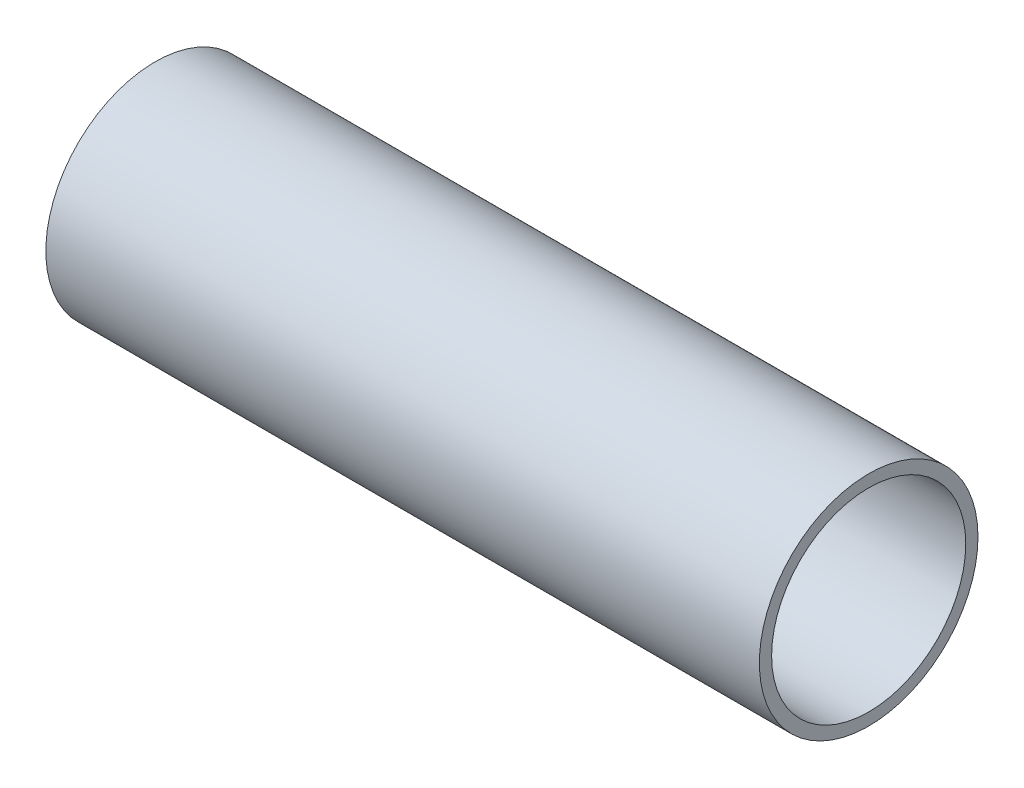
ISO-10303-21;
HEADER;
FILE_DESCRIPTION(('STEP AP214'),'2;1');
FILE_NAME('part.step','',(''),(''),'','','');
FILE_SCHEMA(('AUTOMOTIVE_DESIGN { 1 0 10303 214 1 1 1 1 }'));
ENDSEC;
DATA;
#1=APPLICATION_CONTEXT('core data for automotive mechanical design processes');
#2=APPLICATION_PROTOCOL_DEFINITION('international standard','automotive_design',2000,#1);
#3=PRODUCT_CONTEXT('',#1,'mechanical');
#4=PRODUCT('Part','Part','',(#3));
#5=PRODUCT_RELATED_PRODUCT_CATEGORY('part','',(#4));
#6=PRODUCT_DEFINITION_FORMATION('','',#4);
#7=PRODUCT_DEFINITION_CONTEXT('part definition',#1,'design');
#8=PRODUCT_DEFINITION('design','',#6,#7);
#9=PRODUCT_DEFINITION_SHAPE('','',#8);
#10=(LENGTH_UNIT() NAMED_UNIT(*) SI_UNIT(.MILLI.,.METRE.));
#11=(NAMED_UNIT(*) PLANE_ANGLE_UNIT() SI_UNIT($,.RADIAN.));
#12=(NAMED_UNIT(*) SI_UNIT($,.STERADIAN.) SOLID_ANGLE_UNIT());
#13=UNCERTAINTY_MEASURE_WITH_UNIT(LENGTH_MEASURE(1.E-05),#10,'distance_accuracy_value','');
#14=(GEOMETRIC_REPRESENTATION_CONTEXT(3) GLOBAL_UNCERTAINTY_ASSIGNED_CONTEXT((#13)) GLOBAL_UNIT_ASSIGNED_CONTEXT((#10,
#11,#12)) REPRESENTATION_CONTEXT('',''));
#15=CARTESIAN_POINT('',(0.,0.,0.));
#16=DIRECTION('',(0.,0.,1.));
#17=DIRECTION('',(1.,0.,0.));
#18=AXIS2_PLACEMENT_3D('',#15,#16,#17);
#19=CARTESIAN_POINT('',(-284.815253849037,0.,0.));
#20=DIRECTION('',(-1.,0.,0.));
#21=DIRECTION('',(0.,0.,1.));
#22=AXIS2_PLACEMENT_3D('',#19,#20,#21);
#23=PLANE('',#22);
#24=CARTESIAN_POINT('',(-284.815253849037,0.,0.));
#25=DIRECTION('',(-1.,0.,0.));
#26=DIRECTION('',(0.,0.,1.));
#27=AXIS2_PLACEMENT_3D('',#24,#25,#26);
#28=CIRCLE('',#27,6.35);
#29=CARTESIAN_POINT('',(-284.815253849037,0.,-6.35));
#30=VERTEX_POINT('',#29);
#31=EDGE_CURVE('E41',#30,#30,#28,.T.);
#32=ORIENTED_EDGE('',*,*,#31,.F.);
#33=EDGE_LOOP('',(#32));
#34=FACE_BOUND('',#33,.T.);
#35=CARTESIAN_POINT('',(-284.815253849037,0.,0.));
#36=DIRECTION('',(-1.,0.,0.));
#37=DIRECTION('',(0.,0.,1.));
#38=AXIS2_PLACEMENT_3D('',#35,#36,#37);
#39=CIRCLE('',#38,5.6388);
#40=CARTESIAN_POINT('',(-284.815253849037,0.,-5.6388));
#41=VERTEX_POINT('',#40);
#42=EDGE_CURVE('E51',#41,#41,#39,.T.);
#43=ORIENTED_EDGE('',*,*,#42,.T.);
#44=EDGE_LOOP('',(#43));
#45=FACE_BOUND('',#44,.T.);
#46=ADVANCED_FACE('F37',(#34,#45),#23,.F.);
#47=CARTESIAN_POINT('',(-344.223093310337,0.,0.));
#48=DIRECTION('',(1.,0.,0.));
#49=DIRECTION('',(0.,0.,-1.));
#50=AXIS2_PLACEMENT_3D('',#47,#48,#49);
#51=CYLINDRICAL_SURFACE('',#50,6.35);
#52=CARTESIAN_POINT('',(-326.2625810682,-2.3959347107273E-12,-1.58914958150256E-12));
#53=DIRECTION('',(1.,0.,0.));
#54=DIRECTION('',(0.,-0.387578230128538,0.921836816107075));
#55=AXIS2_PLACEMENT_3D('',#52,#53,#54);
#56=CIRCLE('',#55,6.35);
#57=CARTESIAN_POINT('',(-326.262581068199,0.,-6.35));
#58=VERTEX_POINT('',#57);
#59=EDGE_CURVE('E10',#58,#58,#56,.T.);
#60=CARTESIAN_POINT('',(-326.262581068199,0.,-6.35));
#61=CARTESIAN_POINT('',(-325.830838076333,0.,-6.35));
#62=CARTESIAN_POINT('',(-325.399095084467,0.,-6.35));
#63=CARTESIAN_POINT('',(-324.535609100734,0.,-6.35));
#64=CARTESIAN_POINT('',(-324.103866108868,0.,-6.35));
#65=CARTESIAN_POINT('',(-323.240380125135,0.,-6.35));
#66=CARTESIAN_POINT('',(-322.808637133269,0.,-6.35));
#67=CARTESIAN_POINT('',(-321.945151149536,0.,-6.35));
#68=CARTESIAN_POINT('',(-321.51340815767,0.,-6.35));
#69=CARTESIAN_POINT('',(-320.649922173938,0.,-6.35));
#70=CARTESIAN_POINT('',(-320.218179182071,0.,-6.35));
#71=CARTESIAN_POINT('',(-319.354693198339,0.,-6.35));
#72=CARTESIAN_POINT('',(-318.922950206473,0.,-6.35));
#73=CARTESIAN_POINT('',(-318.05946422274,0.,-6.35));
#74=CARTESIAN_POINT('',(-317.627721230874,0.,-6.35));
#75=CARTESIAN_POINT('',(-316.764235247141,0.,-6.35));
#76=CARTESIAN_POINT('',(-316.332492255275,0.,-6.35));
#77=CARTESIAN_POINT('',(-315.469006271542,0.,-6.35));
#78=CARTESIAN_POINT('',(-315.037263279676,0.,-6.35));
#79=CARTESIAN_POINT('',(-314.173777295944,0.,-6.35));
#80=CARTESIAN_POINT('',(-313.742034304077,0.,-6.35));
#81=CARTESIAN_POINT('',(-312.878548320345,0.,-6.35));
#82=CARTESIAN_POINT('',(-312.446805328478,0.,-6.35));
#83=CARTESIAN_POINT('',(-311.583319344746,0.,-6.35));
#84=CARTESIAN_POINT('',(-311.15157635288,0.,-6.35));
#85=CARTESIAN_POINT('',(-310.288090369147,0.,-6.35));
#86=CARTESIAN_POINT('',(-309.856347377281,0.,-6.35));
#87=CARTESIAN_POINT('',(-308.992861393548,0.,-6.35));
#88=CARTESIAN_POINT('',(-308.561118401682,0.,-6.35));
#89=CARTESIAN_POINT('',(-307.69763241795,0.,-6.35));
#90=CARTESIAN_POINT('',(-307.265889426083,0.,-6.35));
#91=CARTESIAN_POINT('',(-306.402403442351,0.,-6.35));
#92=CARTESIAN_POINT('',(-305.970660450484,0.,-6.35));
#93=CARTESIAN_POINT('',(-305.107174466752,0.,-6.35));
#94=CARTESIAN_POINT('',(-304.675431474886,0.,-6.35));
#95=CARTESIAN_POINT('',(-303.811945491153,0.,-6.35));
#96=CARTESIAN_POINT('',(-303.380202499287,0.,-6.35));
#97=CARTESIAN_POINT('',(-302.516716515554,0.,-6.35));
#98=CARTESIAN_POINT('',(-302.084973523688,0.,-6.35));
#99=CARTESIAN_POINT('',(-301.221487539955,0.,-6.35));
#100=CARTESIAN_POINT('',(-300.789744548089,0.,-6.35));
#101=CARTESIAN_POINT('',(-299.926258564357,0.,-6.35));
#102=CARTESIAN_POINT('',(-299.49451557249,0.,-6.35));
#103=CARTESIAN_POINT('',(-298.631029588758,0.,-6.35));
#104=CARTESIAN_POINT('',(-298.199286596892,0.,-6.35));
#105=CARTESIAN_POINT('',(-297.335800613159,0.,-6.35));
#106=CARTESIAN_POINT('',(-296.904057621293,0.,-6.35));
#107=CARTESIAN_POINT('',(-296.04057163756,0.,-6.35));
#108=CARTESIAN_POINT('',(-295.608828645694,0.,-6.35));
#109=CARTESIAN_POINT('',(-294.745342661961,0.,-6.35));
#110=CARTESIAN_POINT('',(-294.313599670095,0.,-6.35));
#111=CARTESIAN_POINT('',(-293.450113686363,0.,-6.35));
#112=CARTESIAN_POINT('',(-293.018370694496,0.,-6.35));
#113=CARTESIAN_POINT('',(-292.154884710764,0.,-6.35));
#114=CARTESIAN_POINT('',(-291.723141718897,0.,-6.35));
#115=CARTESIAN_POINT('',(-290.859655735165,0.,-6.35));
#116=CARTESIAN_POINT('',(-290.427912743299,0.,-6.35));
#117=CARTESIAN_POINT('',(-289.564426759566,0.,-6.35));
#118=CARTESIAN_POINT('',(-289.1326837677,0.,-6.35));
#119=CARTESIAN_POINT('',(-288.269197783967,0.,-6.35));
#120=CARTESIAN_POINT('',(-287.837454792101,0.,-6.35));
#121=CARTESIAN_POINT('',(-286.973968808368,0.,-6.35));
#122=CARTESIAN_POINT('',(-286.542225816502,0.,-6.35));
#123=CARTESIAN_POINT('',(-285.67873983277,0.,-6.35));
#124=CARTESIAN_POINT('',(-285.246996840903,0.,-6.35));
#125=CARTESIAN_POINT('',(-284.815253849037,0.,-6.35));
#126=B_SPLINE_CURVE_WITH_KNOTS('',3,(#60,#61,#62,#63,#64,#65,#66,#67,#68,#69,#70,#71,#72,#73,
#74,#75,#76,#77,#78,#79,#80,#81,#82,#83,#84,#85,#86,#87,#88,#89,#90,#91,#92,#93,#94,#95,#96,#97,
#98,#99,#100,#101,#102,#103,#104,#105,#106,#107,#108,#109,#110,#111,#112,#113,#114,#115,#116,
#117,#118,#119,#120,#121,#122,#123,#124,#125),.UNSPECIFIED.,.F.,.F.,(4,2,2,2,2,2,2,2,2,2,2,2,2,
2,2,2,2,2,2,2,2,2,2,2,2,2,2,2,2,2,2,2,4),(0.,1.29522897559886,2.59045795119767,3.88568692679647,
5.18091590239528,6.47614487799408,7.77137385359294,9.06660282919175,10.3618318047906,
11.6570607803894,12.9522897559882,14.247518731587,15.5427477071858,16.8379766827846,
18.1332056583834,19.4284346339822,20.7236636095811,22.0188925851799,23.3141215607787,
24.6093505363775,25.9045795119763,27.1998084875751,28.495037463174,29.7902664387728,
31.0854954143716,32.3807243899704,33.6759533655692,34.971182341168,36.2664113167669,
37.5616402923657,38.8568692679645,40.1520982435633,41.4473272191621),.UNSPECIFIED.);
#127=EDGE_CURVE('BSEAM39',#58,#30,#126,.T.);
#128=ORIENTED_EDGE('',*,*,#59,.T.);
#129=ORIENTED_EDGE('',*,*,#31,.T.);
#130=ORIENTED_EDGE('',*,*,#127,.T.);
#131=ORIENTED_EDGE('',*,*,#127,.F.);
#132=EDGE_LOOP('',(#128,#130,#129,#131));
#133=FACE_BOUND('',#132,.T.);
#134=ADVANCED_FACE('F39',(#133),#51,.T.);
#135=CARTESIAN_POINT('',(-344.223093310337,0.,0.));
#136=DIRECTION('',(1.,0.,0.));
#137=DIRECTION('',(0.,0.,-1.));
#138=AXIS2_PLACEMENT_3D('',#135,#136,#137);
#139=CYLINDRICAL_SURFACE('',#138,5.6388);
#140=CARTESIAN_POINT('',(-326.2625810682,-2.3959347107273E-12,-1.58914958150256E-12));
#141=DIRECTION('',(1.,0.,0.));
#142=DIRECTION('',(0.,-0.387578230128538,0.921836816107075));
#143=AXIS2_PLACEMENT_3D('',#140,#141,#142);
#144=CIRCLE('',#143,5.6388);
#145=CARTESIAN_POINT('',(-326.262581068199,0.,-5.6388));
#146=VERTEX_POINT('',#145);
#147=EDGE_CURVE('E45',#146,#146,#144,.T.);
#148=CARTESIAN_POINT('',(-326.262581068199,0.,-5.6388));
#149=CARTESIAN_POINT('',(-325.830838076333,0.,-5.6388));
#150=CARTESIAN_POINT('',(-325.399095084467,0.,-5.6388));
#151=CARTESIAN_POINT('',(-324.535609100734,0.,-5.6388));
#152=CARTESIAN_POINT('',(-324.103866108868,0.,-5.6388));
#153=CARTESIAN_POINT('',(-323.240380125135,0.,-5.6388));
#154=CARTESIAN_POINT('',(-322.808637133269,0.,-5.6388));
#155=CARTESIAN_POINT('',(-321.945151149537,0.,-5.6388));
#156=CARTESIAN_POINT('',(-321.51340815767,0.,-5.6388));
#157=CARTESIAN_POINT('',(-320.649922173938,0.,-5.6388));
#158=CARTESIAN_POINT('',(-320.218179182071,0.,-5.6388));
#159=CARTESIAN_POINT('',(-319.354693198339,0.,-5.6388));
#160=CARTESIAN_POINT('',(-318.922950206473,0.,-5.6388));
#161=CARTESIAN_POINT('',(-318.05946422274,0.,-5.6388));
#162=CARTESIAN_POINT('',(-317.627721230874,0.,-5.6388));
#163=CARTESIAN_POINT('',(-316.764235247141,0.,-5.6388));
#164=CARTESIAN_POINT('',(-316.332492255275,0.,-5.6388));
#165=CARTESIAN_POINT('',(-315.469006271542,0.,-5.6388));
#166=CARTESIAN_POINT('',(-315.037263279676,0.,-5.6388));
#167=CARTESIAN_POINT('',(-314.173777295944,0.,-5.6388));
#168=CARTESIAN_POINT('',(-313.742034304077,0.,-5.6388));
#169=CARTESIAN_POINT('',(-312.878548320345,0.,-5.6388));
#170=CARTESIAN_POINT('',(-312.446805328478,0.,-5.6388));
#171=CARTESIAN_POINT('',(-311.583319344746,0.,-5.6388));
#172=CARTESIAN_POINT('',(-311.15157635288,0.,-5.6388));
#173=CARTESIAN_POINT('',(-310.288090369147,0.,-5.6388));
#174=CARTESIAN_POINT('',(-309.856347377281,0.,-5.6388));
#175=CARTESIAN_POINT('',(-308.992861393548,0.,-5.6388));
#176=CARTESIAN_POINT('',(-308.561118401682,0.,-5.6388));
#177=CARTESIAN_POINT('',(-307.69763241795,0.,-5.6388));
#178=CARTESIAN_POINT('',(-307.265889426083,0.,-5.6388));
#179=CARTESIAN_POINT('',(-306.402403442351,0.,-5.6388));
#180=CARTESIAN_POINT('',(-305.970660450484,0.,-5.6388));
#181=CARTESIAN_POINT('',(-305.107174466752,0.,-5.6388));
#182=CARTESIAN_POINT('',(-304.675431474886,0.,-5.6388));
#183=CARTESIAN_POINT('',(-303.811945491153,0.,-5.6388));
#184=CARTESIAN_POINT('',(-303.380202499287,0.,-5.6388));
#185=CARTESIAN_POINT('',(-302.516716515554,0.,-5.6388));
#186=CARTESIAN_POINT('',(-302.084973523688,0.,-5.6388));
#187=CARTESIAN_POINT('',(-301.221487539955,0.,-5.6388));
#188=CARTESIAN_POINT('',(-300.789744548089,0.,-5.6388));
#189=CARTESIAN_POINT('',(-299.926258564357,0.,-5.6388));
#190=CARTESIAN_POINT('',(-299.49451557249,0.,-5.6388));
#191=CARTESIAN_POINT('',(-298.631029588758,0.,-5.6388));
#192=CARTESIAN_POINT('',(-298.199286596892,0.,-5.6388));
#193=CARTESIAN_POINT('',(-297.335800613159,0.,-5.6388));
#194=CARTESIAN_POINT('',(-296.904057621293,0.,-5.6388));
#195=CARTESIAN_POINT('',(-296.04057163756,0.,-5.6388));
#196=CARTESIAN_POINT('',(-295.608828645694,0.,-5.6388));
#197=CARTESIAN_POINT('',(-294.745342661961,0.,-5.6388));
#198=CARTESIAN_POINT('',(-294.313599670095,0.,-5.6388));
#199=CARTESIAN_POINT('',(-293.450113686363,0.,-5.6388));
#200=CARTESIAN_POINT('',(-293.018370694496,0.,-5.6388));
#201=CARTESIAN_POINT('',(-292.154884710764,0.,-5.6388));
#202=CARTESIAN_POINT('',(-291.723141718897,0.,-5.6388));
#203=CARTESIAN_POINT('',(-290.859655735165,0.,-5.6388));
#204=CARTESIAN_POINT('',(-290.427912743299,0.,-5.6388));
#205=CARTESIAN_POINT('',(-289.564426759566,0.,-5.6388));
#206=CARTESIAN_POINT('',(-289.1326837677,0.,-5.6388));
#207=CARTESIAN_POINT('',(-288.269197783967,0.,-5.6388));
#208=CARTESIAN_POINT('',(-287.837454792101,0.,-5.6388));
#209=CARTESIAN_POINT('',(-286.973968808369,0.,-5.6388));
#210=CARTESIAN_POINT('',(-286.542225816502,0.,-5.6388));
#211=CARTESIAN_POINT('',(-285.67873983277,0.,-5.6388));
#212=CARTESIAN_POINT('',(-285.246996840903,0.,-5.6388));
#213=CARTESIAN_POINT('',(-284.815253849037,0.,-5.6388));
#214=B_SPLINE_CURVE_WITH_KNOTS('',3,(#148,#149,#150,#151,#152,#153,#154,#155,#156,#157,#158,
#159,#160,#161,#162,#163,#164,#165,#166,#167,#168,#169,#170,#171,#172,#173,#174,#175,#176,#177,
#178,#179,#180,#181,#182,#183,#184,#185,#186,#187,#188,#189,#190,#191,#192,#193,#194,#195,#196,
#197,#198,#199,#200,#201,#202,#203,#204,#205,#206,#207,#208,#209,#210,#211,#212,#213),
.UNSPECIFIED.,.F.,.F.,(4,2,2,2,2,2,2,2,2,2,2,2,2,2,2,2,2,2,2,2,2,2,2,2,2,2,2,2,2,2,2,2,4),(0.,
1.29522897559881,2.59045795119761,3.88568692679642,5.18091590239522,6.47614487799403,
7.77137385359289,9.06660282919169,10.3618318047905,11.6570607803893,12.9522897559881,
14.247518731587,15.5427477071858,16.8379766827846,18.1332056583834,19.4284346339822,
20.7236636095811,22.0188925851799,23.3141215607787,24.6093505363775,25.9045795119763,
27.1998084875751,28.4950374631739,29.7902664387728,31.0854954143716,32.3807243899704,
33.6759533655692,34.971182341168,36.2664113167668,37.5616402923656,38.8568692679644,
40.1520982435633,41.4473272191621),.UNSPECIFIED.);
#215=EDGE_CURVE('BSEAM63',#146,#41,#214,.T.);
#216=ORIENTED_EDGE('',*,*,#147,.F.);
#217=ORIENTED_EDGE('',*,*,#42,.F.);
#218=ORIENTED_EDGE('',*,*,#215,.T.);
#219=ORIENTED_EDGE('',*,*,#215,.F.);
#220=EDGE_LOOP('',(#216,#218,#217,#219));
#221=FACE_BOUND('',#220,.T.);
#222=ADVANCED_FACE('F63',(#221),#139,.F.);
#223=CARTESIAN_POINT('',(-326.2625810682,-2.3959347107273E-12,-1.58914958150256E-12));
#224=DIRECTION('',(1.,0.,0.));
#225=DIRECTION('',(0.,-0.387578230128538,0.921836816107075));
#226=AXIS2_PLACEMENT_3D('',#223,#224,#225);
#227=PLANE('',#226);
#228=ORIENTED_EDGE('',*,*,#147,.T.);
#229=EDGE_LOOP('',(#228));
#230=FACE_BOUND('',#229,.T.);
#231=ORIENTED_EDGE('',*,*,#59,.F.);
#232=EDGE_LOOP('',(#231));
#233=FACE_BOUND('',#232,.T.);
#234=ADVANCED_FACE('F67',(#230,#233),#227,.F.);
#235=CLOSED_SHELL('',(#46,#134,#222,#234));
#236=MANIFOLD_SOLID_BREP('B2',#235);
#237=ADVANCED_BREP_SHAPE_REPRESENTATION('',(#18,#236),#14);
#238=SHAPE_DEFINITION_REPRESENTATION(#9,#237);
ENDSEC;
END-ISO-10303-21;
